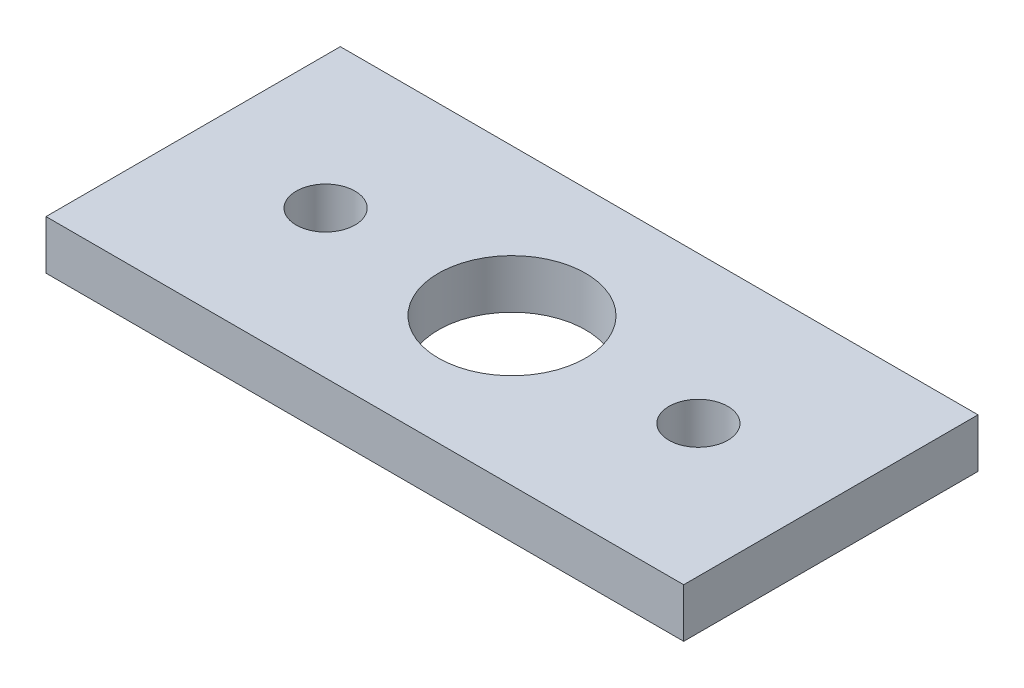
ISO-10303-21;
HEADER;
FILE_DESCRIPTION(('STEP AP214'),'2;1');
FILE_NAME('part.step','',(''),(''),'','','');
FILE_SCHEMA(('AUTOMOTIVE_DESIGN { 1 0 10303 214 1 1 1 1 }'));
ENDSEC;
DATA;
#1=APPLICATION_CONTEXT('core data for automotive mechanical design processes');
#2=APPLICATION_PROTOCOL_DEFINITION('international standard','automotive_design',2000,#1);
#3=PRODUCT_CONTEXT('',#1,'mechanical');
#4=PRODUCT('Part','Part','',(#3));
#5=PRODUCT_RELATED_PRODUCT_CATEGORY('part','',(#4));
#6=PRODUCT_DEFINITION_FORMATION('','',#4);
#7=PRODUCT_DEFINITION_CONTEXT('part definition',#1,'design');
#8=PRODUCT_DEFINITION('design','',#6,#7);
#9=PRODUCT_DEFINITION_SHAPE('','',#8);
#10=(LENGTH_UNIT() NAMED_UNIT(*) SI_UNIT(.MILLI.,.METRE.));
#11=(NAMED_UNIT(*) PLANE_ANGLE_UNIT() SI_UNIT($,.RADIAN.));
#12=(NAMED_UNIT(*) SI_UNIT($,.STERADIAN.) SOLID_ANGLE_UNIT());
#13=UNCERTAINTY_MEASURE_WITH_UNIT(LENGTH_MEASURE(1.E-05),#10,'distance_accuracy_value','');
#14=(GEOMETRIC_REPRESENTATION_CONTEXT(3) GLOBAL_UNCERTAINTY_ASSIGNED_CONTEXT((#13)) GLOBAL_UNIT_ASSIGNED_CONTEXT((#10,
#11,#12)) REPRESENTATION_CONTEXT('',''));
#15=CARTESIAN_POINT('',(0.,0.,0.));
#16=DIRECTION('',(0.,0.,1.));
#17=DIRECTION('',(1.,0.,0.));
#18=AXIS2_PLACEMENT_3D('',#15,#16,#17);
#19=CARTESIAN_POINT('',(0.,5.,0.));
#20=DIRECTION('',(0.,-1.,0.));
#21=DIRECTION('',(0.,0.,-1.));
#22=AXIS2_PLACEMENT_3D('',#19,#20,#21);
#23=PLANE('',#22);
#24=DIRECTION('',(0.,0.,1.));
#25=VECTOR('',#24,1.);
#26=CARTESIAN_POINT('',(0.,5.,0.));
#27=LINE('',#26,#25);
#28=CARTESIAN_POINT('',(0.,5.,-30.));
#29=VERTEX_POINT('',#28);
#30=CARTESIAN_POINT('',(0.,5.,0.));
#31=VERTEX_POINT('',#30);
#32=EDGE_CURVE('E85',#29,#31,#27,.T.);
#33=ORIENTED_EDGE('',*,*,#32,.T.);
#34=DIRECTION('',(1.,0.,0.));
#35=VECTOR('',#34,1.);
#36=CARTESIAN_POINT('',(0.,5.,0.));
#37=LINE('',#36,#35);
#38=CARTESIAN_POINT('',(65.,5.,0.));
#39=VERTEX_POINT('',#38);
#40=EDGE_CURVE('E80',#31,#39,#37,.T.);
#41=ORIENTED_EDGE('',*,*,#40,.T.);
#42=DIRECTION('',(0.,0.,-1.));
#43=VECTOR('',#42,1.);
#44=CARTESIAN_POINT('',(65.,5.,0.));
#45=LINE('',#44,#43);
#46=CARTESIAN_POINT('',(65.,5.,-30.));
#47=VERTEX_POINT('',#46);
#48=EDGE_CURVE('E83',#39,#47,#45,.T.);
#49=ORIENTED_EDGE('',*,*,#48,.T.);
#50=DIRECTION('',(-1.,0.,0.));
#51=VECTOR('',#50,1.);
#52=CARTESIAN_POINT('',(0.,5.,-30.));
#53=LINE('',#52,#51);
#54=EDGE_CURVE('E50',#47,#29,#53,.T.);
#55=ORIENTED_EDGE('',*,*,#54,.T.);
#56=EDGE_LOOP('',(#33,#41,#49,#55));
#57=FACE_BOUND('',#56,.T.);
#58=CARTESIAN_POINT('',(32.5,5.,-15.));
#59=DIRECTION('',(0.,1.,0.));
#60=DIRECTION('',(0.,0.,1.));
#61=AXIS2_PLACEMENT_3D('',#58,#59,#60);
#62=CIRCLE('',#61,7.5);
#63=CARTESIAN_POINT('',(32.5,5.,-7.49999999999999));
#64=VERTEX_POINT('',#63);
#65=EDGE_CURVE('E100',#64,#64,#62,.T.);
#66=ORIENTED_EDGE('',*,*,#65,.F.);
#67=EDGE_LOOP('',(#66));
#68=FACE_BOUND('',#67,.T.);
#69=CARTESIAN_POINT('',(13.5,5.,-15.));
#70=DIRECTION('',(0.,1.,0.));
#71=DIRECTION('',(0.,0.,1.));
#72=AXIS2_PLACEMENT_3D('',#69,#70,#71);
#73=CIRCLE('',#72,3.);
#74=CARTESIAN_POINT('',(13.5,5.,-12.));
#75=VERTEX_POINT('',#74);
#76=EDGE_CURVE('E115',#75,#75,#73,.T.);
#77=ORIENTED_EDGE('',*,*,#76,.F.);
#78=EDGE_LOOP('',(#77));
#79=FACE_BOUND('',#78,.T.);
#80=CARTESIAN_POINT('',(51.5,5.,-15.));
#81=DIRECTION('',(0.,1.,0.));
#82=DIRECTION('',(0.,0.,-1.));
#83=AXIS2_PLACEMENT_3D('',#80,#81,#82);
#84=CIRCLE('',#83,3.);
#85=CARTESIAN_POINT('',(51.5,5.,-18.));
#86=VERTEX_POINT('',#85);
#87=EDGE_CURVE('E121',#86,#86,#84,.T.);
#88=ORIENTED_EDGE('',*,*,#87,.F.);
#89=EDGE_LOOP('',(#88));
#90=FACE_BOUND('',#89,.T.);
#91=ADVANCED_FACE('F33',(#57,#68,#79,#90),#23,.F.);
#92=CARTESIAN_POINT('',(0.,0.,0.));
#93=DIRECTION('',(0.,-1.,0.));
#94=DIRECTION('',(0.,0.,-1.));
#95=AXIS2_PLACEMENT_3D('',#92,#93,#94);
#96=PLANE('',#95);
#97=CARTESIAN_POINT('',(13.5,0.,-15.));
#98=DIRECTION('',(0.,1.,0.));
#99=DIRECTION('',(0.,0.,1.));
#100=AXIS2_PLACEMENT_3D('',#97,#98,#99);
#101=CIRCLE('',#100,3.);
#102=CARTESIAN_POINT('',(13.5,0.,-12.));
#103=VERTEX_POINT('',#102);
#104=EDGE_CURVE('E118',#103,#103,#101,.T.);
#105=ORIENTED_EDGE('',*,*,#104,.T.);
#106=EDGE_LOOP('',(#105));
#107=FACE_BOUND('',#106,.T.);
#108=DIRECTION('',(0.,0.,1.));
#109=VECTOR('',#108,1.);
#110=CARTESIAN_POINT('',(0.,0.,0.));
#111=LINE('',#110,#109);
#112=CARTESIAN_POINT('',(0.,0.,-30.));
#113=VERTEX_POINT('',#112);
#114=CARTESIAN_POINT('',(0.,0.,0.));
#115=VERTEX_POINT('',#114);
#116=EDGE_CURVE('E97',#113,#115,#111,.T.);
#117=ORIENTED_EDGE('',*,*,#116,.F.);
#118=DIRECTION('',(-1.,0.,0.));
#119=VECTOR('',#118,1.);
#120=CARTESIAN_POINT('',(0.,0.,-30.));
#121=LINE('',#120,#119);
#122=CARTESIAN_POINT('',(65.,0.,-30.));
#123=VERTEX_POINT('',#122);
#124=EDGE_CURVE('E73',#123,#113,#121,.T.);
#125=ORIENTED_EDGE('',*,*,#124,.F.);
#126=DIRECTION('',(0.,0.,-1.));
#127=VECTOR('',#126,1.);
#128=CARTESIAN_POINT('',(65.,0.,0.));
#129=LINE('',#128,#127);
#130=CARTESIAN_POINT('',(65.,0.,0.));
#131=VERTEX_POINT('',#130);
#132=EDGE_CURVE('E67',#131,#123,#129,.T.);
#133=ORIENTED_EDGE('',*,*,#132,.F.);
#134=DIRECTION('',(1.,0.,0.));
#135=VECTOR('',#134,1.);
#136=CARTESIAN_POINT('',(0.,0.,0.));
#137=LINE('',#136,#135);
#138=EDGE_CURVE('E89',#115,#131,#137,.T.);
#139=ORIENTED_EDGE('',*,*,#138,.F.);
#140=EDGE_LOOP('',(#117,#125,#133,#139));
#141=FACE_BOUND('',#140,.T.);
#142=CARTESIAN_POINT('',(32.5,0.,-15.));
#143=DIRECTION('',(0.,1.,0.));
#144=DIRECTION('',(0.,0.,1.));
#145=AXIS2_PLACEMENT_3D('',#142,#143,#144);
#146=CIRCLE('',#145,7.5);
#147=CARTESIAN_POINT('',(32.5,0.,-7.49999999999999));
#148=VERTEX_POINT('',#147);
#149=EDGE_CURVE('E112',#148,#148,#146,.T.);
#150=ORIENTED_EDGE('',*,*,#149,.T.);
#151=EDGE_LOOP('',(#150));
#152=FACE_BOUND('',#151,.T.);
#153=CARTESIAN_POINT('',(51.5,0.,-15.));
#154=DIRECTION('',(0.,1.,0.));
#155=DIRECTION('',(0.,0.,-1.));
#156=AXIS2_PLACEMENT_3D('',#153,#154,#155);
#157=CIRCLE('',#156,3.);
#158=CARTESIAN_POINT('',(51.5,0.,-18.));
#159=VERTEX_POINT('',#158);
#160=EDGE_CURVE('E124',#159,#159,#157,.T.);
#161=ORIENTED_EDGE('',*,*,#160,.T.);
#162=EDGE_LOOP('',(#161));
#163=FACE_BOUND('',#162,.T.);
#164=ADVANCED_FACE('F108',(#107,#141,#152,#163),#96,.T.);
#165=CARTESIAN_POINT('',(0.,5.,0.));
#166=DIRECTION('',(1.,0.,0.));
#167=DIRECTION('',(0.,0.,-1.));
#168=AXIS2_PLACEMENT_3D('',#165,#166,#167);
#169=PLANE('',#168);
#170=ORIENTED_EDGE('',*,*,#116,.T.);
#171=DIRECTION('',(0.,-1.,0.));
#172=VECTOR('',#171,1.);
#173=CARTESIAN_POINT('',(0.,5.,0.));
#174=LINE('',#173,#172);
#175=EDGE_CURVE('E11',#31,#115,#174,.T.);
#176=ORIENTED_EDGE('',*,*,#175,.F.);
#177=ORIENTED_EDGE('',*,*,#32,.F.);
#178=DIRECTION('',(0.,-1.,0.));
#179=VECTOR('',#178,1.);
#180=CARTESIAN_POINT('',(0.,5.,-30.));
#181=LINE('',#180,#179);
#182=EDGE_CURVE('E93',#29,#113,#181,.T.);
#183=ORIENTED_EDGE('',*,*,#182,.T.);
#184=EDGE_LOOP('',(#170,#176,#177,#183));
#185=FACE_BOUND('',#184,.T.);
#186=ADVANCED_FACE('F35',(#185),#169,.F.);
#187=CARTESIAN_POINT('',(0.,5.,0.));
#188=DIRECTION('',(0.,0.,-1.));
#189=DIRECTION('',(-1.,0.,0.));
#190=AXIS2_PLACEMENT_3D('',#187,#188,#189);
#191=PLANE('',#190);
#192=ORIENTED_EDGE('',*,*,#138,.T.);
#193=DIRECTION('',(0.,-1.,0.));
#194=VECTOR('',#193,1.);
#195=CARTESIAN_POINT('',(65.,5.,0.));
#196=LINE('',#195,#194);
#197=EDGE_CURVE('E42',#39,#131,#196,.T.);
#198=ORIENTED_EDGE('',*,*,#197,.F.);
#199=ORIENTED_EDGE('',*,*,#40,.F.);
#200=ORIENTED_EDGE('',*,*,#175,.T.);
#201=EDGE_LOOP('',(#192,#198,#199,#200));
#202=FACE_BOUND('',#201,.T.);
#203=ADVANCED_FACE('F88',(#202),#191,.F.);
#204=CARTESIAN_POINT('',(65.,5.,0.));
#205=DIRECTION('',(-1.,0.,0.));
#206=DIRECTION('',(0.,0.,1.));
#207=AXIS2_PLACEMENT_3D('',#204,#205,#206);
#208=PLANE('',#207);
#209=ORIENTED_EDGE('',*,*,#132,.T.);
#210=DIRECTION('',(0.,-1.,0.));
#211=VECTOR('',#210,1.);
#212=CARTESIAN_POINT('',(65.,5.,-30.));
#213=LINE('',#212,#211);
#214=EDGE_CURVE('E90',#47,#123,#213,.T.);
#215=ORIENTED_EDGE('',*,*,#214,.F.);
#216=ORIENTED_EDGE('',*,*,#48,.F.);
#217=ORIENTED_EDGE('',*,*,#197,.T.);
#218=EDGE_LOOP('',(#209,#215,#216,#217));
#219=FACE_BOUND('',#218,.T.);
#220=ADVANCED_FACE('F91',(#219),#208,.F.);
#221=CARTESIAN_POINT('',(0.,5.,-30.));
#222=DIRECTION('',(0.,0.,1.));
#223=DIRECTION('',(1.,0.,0.));
#224=AXIS2_PLACEMENT_3D('',#221,#222,#223);
#225=PLANE('',#224);
#226=ORIENTED_EDGE('',*,*,#124,.T.);
#227=ORIENTED_EDGE('',*,*,#182,.F.);
#228=ORIENTED_EDGE('',*,*,#54,.F.);
#229=ORIENTED_EDGE('',*,*,#214,.T.);
#230=EDGE_LOOP('',(#226,#227,#228,#229));
#231=FACE_BOUND('',#230,.T.);
#232=ADVANCED_FACE('F105',(#231),#225,.F.);
#233=CARTESIAN_POINT('',(32.5,5.,-15.));
#234=DIRECTION('',(0.,-1.,0.));
#235=DIRECTION('',(0.,0.,-1.));
#236=AXIS2_PLACEMENT_3D('',#233,#234,#235);
#237=CYLINDRICAL_SURFACE('',#236,7.5);
#238=ORIENTED_EDGE('',*,*,#65,.T.);
#239=EDGE_LOOP('',(#238));
#240=FACE_BOUND('',#239,.T.);
#241=ORIENTED_EDGE('',*,*,#149,.F.);
#242=EDGE_LOOP('',(#241));
#243=FACE_BOUND('',#242,.T.);
#244=ADVANCED_FACE('F141',(#240,#243),#237,.F.);
#245=CARTESIAN_POINT('',(13.5,5.,-15.));
#246=DIRECTION('',(0.,-1.,0.));
#247=DIRECTION('',(0.,0.,-1.));
#248=AXIS2_PLACEMENT_3D('',#245,#246,#247);
#249=CYLINDRICAL_SURFACE('',#248,3.);
#250=ORIENTED_EDGE('',*,*,#76,.T.);
#251=EDGE_LOOP('',(#250));
#252=FACE_BOUND('',#251,.T.);
#253=ORIENTED_EDGE('',*,*,#104,.F.);
#254=EDGE_LOOP('',(#253));
#255=FACE_BOUND('',#254,.T.);
#256=ADVANCED_FACE('F187',(#252,#255),#249,.F.);
#257=CARTESIAN_POINT('',(51.5,5.,-15.));
#258=DIRECTION('',(0.,-1.,0.));
#259=DIRECTION('',(0.,0.,-1.));
#260=AXIS2_PLACEMENT_3D('',#257,#258,#259);
#261=CYLINDRICAL_SURFACE('',#260,3.);
#262=ORIENTED_EDGE('',*,*,#87,.T.);
#263=EDGE_LOOP('',(#262));
#264=FACE_BOUND('',#263,.T.);
#265=ORIENTED_EDGE('',*,*,#160,.F.);
#266=EDGE_LOOP('',(#265));
#267=FACE_BOUND('',#266,.T.);
#268=ADVANCED_FACE('F130',(#264,#267),#261,.F.);
#269=CLOSED_SHELL('',(#91,#164,#186,#203,#220,#232,#244,#256,#268));
#270=MANIFOLD_SOLID_BREP('B2',#269);
#271=ADVANCED_BREP_SHAPE_REPRESENTATION('',(#18,#270),#14);
#272=SHAPE_DEFINITION_REPRESENTATION(#9,#271);
ENDSEC;
END-ISO-10303-21;
